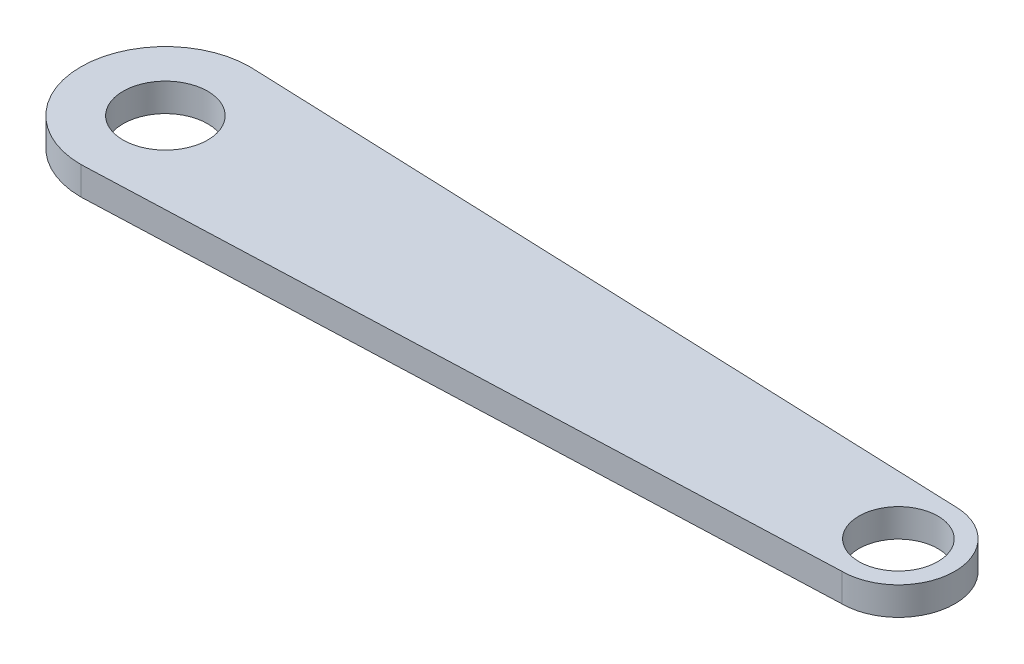
ISO-10303-21;
HEADER;
FILE_DESCRIPTION(('STEP AP214'),'2;1');
FILE_NAME('part.step','',(''),(''),'','','');
FILE_SCHEMA(('AUTOMOTIVE_DESIGN { 1 0 10303 214 1 1 1 1 }'));
ENDSEC;
DATA;
#1=APPLICATION_CONTEXT('core data for automotive mechanical design processes');
#2=APPLICATION_PROTOCOL_DEFINITION('international standard','automotive_design',2000,#1);
#3=PRODUCT_CONTEXT('',#1,'mechanical');
#4=PRODUCT('Part','Part','',(#3));
#5=PRODUCT_RELATED_PRODUCT_CATEGORY('part','',(#4));
#6=PRODUCT_DEFINITION_FORMATION('','',#4);
#7=PRODUCT_DEFINITION_CONTEXT('part definition',#1,'design');
#8=PRODUCT_DEFINITION('design','',#6,#7);
#9=PRODUCT_DEFINITION_SHAPE('','',#8);
#10=(LENGTH_UNIT() NAMED_UNIT(*) SI_UNIT(.MILLI.,.METRE.));
#11=(NAMED_UNIT(*) PLANE_ANGLE_UNIT() SI_UNIT($,.RADIAN.));
#12=(NAMED_UNIT(*) SI_UNIT($,.STERADIAN.) SOLID_ANGLE_UNIT());
#13=UNCERTAINTY_MEASURE_WITH_UNIT(LENGTH_MEASURE(1.E-05),#10,'distance_accuracy_value','');
#14=(GEOMETRIC_REPRESENTATION_CONTEXT(3) GLOBAL_UNCERTAINTY_ASSIGNED_CONTEXT((#13)) GLOBAL_UNIT_ASSIGNED_CONTEXT((#10,
#11,#12)) REPRESENTATION_CONTEXT('',''));
#15=CARTESIAN_POINT('',(0.,0.,0.));
#16=DIRECTION('',(0.,0.,1.));
#17=DIRECTION('',(1.,0.,0.));
#18=AXIS2_PLACEMENT_3D('',#15,#16,#17);
#19=CARTESIAN_POINT('',(-115.540454705686,5.,0.));
#20=DIRECTION('',(0.,-1.,0.));
#21=DIRECTION('',(0.,0.,-1.));
#22=AXIS2_PLACEMENT_3D('',#19,#20,#21);
#23=CYLINDRICAL_SURFACE('',#22,15.);
#24=CARTESIAN_POINT('',(-115.540454705686,0.,0.));
#25=DIRECTION('',(0.,1.,0.));
#26=DIRECTION('',(0.,0.,1.));
#27=AXIS2_PLACEMENT_3D('',#24,#25,#26);
#28=CIRCLE('',#27,15.);
#29=CARTESIAN_POINT('',(-115.540454705686,0.,-15.));
#30=VERTEX_POINT('',#29);
#31=CARTESIAN_POINT('',(-115.540454705686,0.,15.));
#32=VERTEX_POINT('',#31);
#33=EDGE_CURVE('E96',#30,#32,#28,.T.);
#34=ORIENTED_EDGE('',*,*,#33,.T.);
#35=DIRECTION('',(0.,-1.,0.));
#36=VECTOR('',#35,1.);
#37=CARTESIAN_POINT('',(-115.540454705686,5.,15.));
#38=LINE('',#37,#36);
#39=CARTESIAN_POINT('',(-115.540454705686,5.,15.));
#40=VERTEX_POINT('',#39);
#41=EDGE_CURVE('E11',#40,#32,#38,.T.);
#42=ORIENTED_EDGE('',*,*,#41,.F.);
#43=CARTESIAN_POINT('',(-115.540454705686,5.,0.));
#44=DIRECTION('',(0.,1.,0.));
#45=DIRECTION('',(0.,0.,1.));
#46=AXIS2_PLACEMENT_3D('',#43,#44,#45);
#47=CIRCLE('',#46,15.);
#48=CARTESIAN_POINT('',(-115.540454705686,5.,-15.));
#49=VERTEX_POINT('',#48);
#50=EDGE_CURVE('E84',#49,#40,#47,.T.);
#51=ORIENTED_EDGE('',*,*,#50,.F.);
#52=DIRECTION('',(0.,-1.,0.));
#53=VECTOR('',#52,1.);
#54=CARTESIAN_POINT('',(-115.540454705686,5.,-15.));
#55=LINE('',#54,#53);
#56=EDGE_CURVE('E92',#49,#30,#55,.T.);
#57=ORIENTED_EDGE('',*,*,#56,.T.);
#58=EDGE_LOOP('',(#34,#42,#51,#57));
#59=FACE_BOUND('',#58,.T.);
#60=ADVANCED_FACE('F33',(#59),#23,.T.);
#61=CARTESIAN_POINT('',(-115.540454705686,5.,15.));
#62=DIRECTION('',(-0.0384331221012044,0.,-0.999261174631314));
#63=DIRECTION('',(-0.999261174631314,0.,0.0384331221012044));
#64=AXIS2_PLACEMENT_3D('',#61,#62,#63);
#65=PLANE('',#64);
#66=DIRECTION('',(0.999261174631314,0.,-0.0384331221012044));
#67=VECTOR('',#66,1.);
#68=CARTESIAN_POINT('',(-115.540454705686,0.,15.));
#69=LINE('',#68,#67);
#70=CARTESIAN_POINT('',(14.459545294314,0.,10.));
#71=VERTEX_POINT('',#70);
#72=EDGE_CURVE('E88',#32,#71,#69,.T.);
#73=ORIENTED_EDGE('',*,*,#72,.T.);
#74=DIRECTION('',(0.,-1.,0.));
#75=VECTOR('',#74,1.);
#76=CARTESIAN_POINT('',(14.459545294314,5.,10.));
#77=LINE('',#76,#75);
#78=CARTESIAN_POINT('',(14.459545294314,5.,10.));
#79=VERTEX_POINT('',#78);
#80=EDGE_CURVE('E41',#79,#71,#77,.T.);
#81=ORIENTED_EDGE('',*,*,#80,.F.);
#82=DIRECTION('',(0.999261174631314,0.,-0.0384331221012044));
#83=VECTOR('',#82,1.);
#84=CARTESIAN_POINT('',(-115.540454705686,5.,15.));
#85=LINE('',#84,#83);
#86=EDGE_CURVE('E79',#40,#79,#85,.T.);
#87=ORIENTED_EDGE('',*,*,#86,.F.);
#88=ORIENTED_EDGE('',*,*,#41,.T.);
#89=EDGE_LOOP('',(#73,#81,#87,#88));
#90=FACE_BOUND('',#89,.T.);
#91=ADVANCED_FACE('F87',(#90),#65,.F.);
#92=CARTESIAN_POINT('',(14.459545294314,5.,0.));
#93=DIRECTION('',(0.,-1.,0.));
#94=DIRECTION('',(0.,0.,-1.));
#95=AXIS2_PLACEMENT_3D('',#92,#93,#94);
#96=CYLINDRICAL_SURFACE('',#95,10.);
#97=CARTESIAN_POINT('',(14.459545294314,0.,0.));
#98=DIRECTION('',(0.,1.,0.));
#99=DIRECTION('',(0.,0.,1.));
#100=AXIS2_PLACEMENT_3D('',#97,#98,#99);
#101=CIRCLE('',#100,10.);
#102=CARTESIAN_POINT('',(14.459545294314,0.,-10.));
#103=VERTEX_POINT('',#102);
#104=EDGE_CURVE('E66',#71,#103,#101,.T.);
#105=ORIENTED_EDGE('',*,*,#104,.T.);
#106=DIRECTION('',(0.,-1.,0.));
#107=VECTOR('',#106,1.);
#108=CARTESIAN_POINT('',(14.459545294314,5.,-10.));
#109=LINE('',#108,#107);
#110=CARTESIAN_POINT('',(14.459545294314,5.,-10.));
#111=VERTEX_POINT('',#110);
#112=EDGE_CURVE('E89',#111,#103,#109,.T.);
#113=ORIENTED_EDGE('',*,*,#112,.F.);
#114=CARTESIAN_POINT('',(14.459545294314,5.,0.));
#115=DIRECTION('',(0.,1.,0.));
#116=DIRECTION('',(0.,0.,1.));
#117=AXIS2_PLACEMENT_3D('',#114,#115,#116);
#118=CIRCLE('',#117,10.);
#119=EDGE_CURVE('E82',#79,#111,#118,.T.);
#120=ORIENTED_EDGE('',*,*,#119,.F.);
#121=ORIENTED_EDGE('',*,*,#80,.T.);
#122=EDGE_LOOP('',(#105,#113,#120,#121));
#123=FACE_BOUND('',#122,.T.);
#124=ADVANCED_FACE('F90',(#123),#96,.T.);
#125=CARTESIAN_POINT('',(-115.540454705686,5.,-15.));
#126=DIRECTION('',(-0.0384331221012044,0.,0.999261174631314));
#127=DIRECTION('',(0.999261174631314,0.,0.0384331221012044));
#128=AXIS2_PLACEMENT_3D('',#125,#126,#127);
#129=PLANE('',#128);
#130=DIRECTION('',(-0.999261174631314,0.,-0.0384331221012044));
#131=VECTOR('',#130,1.);
#132=CARTESIAN_POINT('',(-115.540454705686,0.,-15.));
#133=LINE('',#132,#131);
#134=EDGE_CURVE('E72',#103,#30,#133,.T.);
#135=ORIENTED_EDGE('',*,*,#134,.T.);
#136=ORIENTED_EDGE('',*,*,#56,.F.);
#137=DIRECTION('',(-0.999261174631314,0.,-0.0384331221012044));
#138=VECTOR('',#137,1.);
#139=CARTESIAN_POINT('',(-115.540454705686,5.,-15.));
#140=LINE('',#139,#138);
#141=EDGE_CURVE('E49',#111,#49,#140,.T.);
#142=ORIENTED_EDGE('',*,*,#141,.F.);
#143=ORIENTED_EDGE('',*,*,#112,.T.);
#144=EDGE_LOOP('',(#135,#136,#142,#143));
#145=FACE_BOUND('',#144,.T.);
#146=ADVANCED_FACE('F104',(#145),#129,.F.);
#147=CARTESIAN_POINT('',(-115.540454705686,5.,0.));
#148=DIRECTION('',(0.,1.,0.));
#149=DIRECTION('',(0.,0.,1.));
#150=AXIS2_PLACEMENT_3D('',#147,#148,#149);
#151=PLANE('',#150);
#152=CARTESIAN_POINT('',(14.459545294314,5.,0.));
#153=DIRECTION('',(0.,1.,0.));
#154=DIRECTION('',(0.,0.,1.));
#155=AXIS2_PLACEMENT_3D('',#152,#153,#154);
#156=CIRCLE('',#155,7.);
#157=CARTESIAN_POINT('',(14.459545294314,5.,7.));
#158=VERTEX_POINT('',#157);
#159=EDGE_CURVE('E99',#158,#158,#156,.T.);
#160=ORIENTED_EDGE('',*,*,#159,.F.);
#161=EDGE_LOOP('',(#160));
#162=FACE_BOUND('',#161,.T.);
#163=CARTESIAN_POINT('',(-115.540454705686,5.,0.));
#164=DIRECTION('',(0.,1.,0.));
#165=DIRECTION('',(0.,0.,1.));
#166=AXIS2_PLACEMENT_3D('',#163,#164,#165);
#167=CIRCLE('',#166,7.50000000000001);
#168=CARTESIAN_POINT('',(-115.540454705686,5.,7.50000000000001));
#169=VERTEX_POINT('',#168);
#170=EDGE_CURVE('E112',#169,#169,#167,.T.);
#171=ORIENTED_EDGE('',*,*,#170,.F.);
#172=EDGE_LOOP('',(#171));
#173=FACE_BOUND('',#172,.T.);
#174=ORIENTED_EDGE('',*,*,#50,.T.);
#175=ORIENTED_EDGE('',*,*,#86,.T.);
#176=ORIENTED_EDGE('',*,*,#119,.T.);
#177=ORIENTED_EDGE('',*,*,#141,.T.);
#178=EDGE_LOOP('',(#174,#175,#176,#177));
#179=FACE_BOUND('',#178,.T.);
#180=ADVANCED_FACE('F80',(#162,#173,#179),#151,.T.);
#181=CARTESIAN_POINT('',(-115.540454705686,0.,0.));
#182=DIRECTION('',(0.,1.,0.));
#183=DIRECTION('',(0.,0.,1.));
#184=AXIS2_PLACEMENT_3D('',#181,#182,#183);
#185=PLANE('',#184);
#186=CARTESIAN_POINT('',(14.459545294314,0.,0.));
#187=DIRECTION('',(0.,-1.,0.));
#188=DIRECTION('',(0.,0.,-1.));
#189=AXIS2_PLACEMENT_3D('',#186,#187,#188);
#190=CIRCLE('',#189,7.);
#191=CARTESIAN_POINT('',(14.459545294314,0.,-7.));
#192=VERTEX_POINT('',#191);
#193=EDGE_CURVE('E115',#192,#192,#190,.T.);
#194=ORIENTED_EDGE('',*,*,#193,.F.);
#195=EDGE_LOOP('',(#194));
#196=FACE_BOUND('',#195,.T.);
#197=CARTESIAN_POINT('',(-115.540454705686,0.,0.));
#198=DIRECTION('',(0.,-1.,0.));
#199=DIRECTION('',(0.,0.,-1.));
#200=AXIS2_PLACEMENT_3D('',#197,#198,#199);
#201=CIRCLE('',#200,7.50000000000001);
#202=CARTESIAN_POINT('',(-115.540454705686,0.,-7.50000000000001));
#203=VERTEX_POINT('',#202);
#204=EDGE_CURVE('E116',#203,#203,#201,.T.);
#205=ORIENTED_EDGE('',*,*,#204,.F.);
#206=EDGE_LOOP('',(#205));
#207=FACE_BOUND('',#206,.T.);
#208=ORIENTED_EDGE('',*,*,#33,.F.);
#209=ORIENTED_EDGE('',*,*,#134,.F.);
#210=ORIENTED_EDGE('',*,*,#104,.F.);
#211=ORIENTED_EDGE('',*,*,#72,.F.);
#212=EDGE_LOOP('',(#208,#209,#210,#211));
#213=FACE_BOUND('',#212,.T.);
#214=ADVANCED_FACE('F107',(#196,#207,#213),#185,.F.);
#215=CARTESIAN_POINT('',(-115.540454705686,10.,0.));
#216=DIRECTION('',(0.,-1.,0.));
#217=DIRECTION('',(0.,0.,-1.));
#218=AXIS2_PLACEMENT_3D('',#215,#216,#217);
#219=CYLINDRICAL_SURFACE('',#218,7.50000000000001);
#220=ORIENTED_EDGE('',*,*,#170,.T.);
#221=EDGE_LOOP('',(#220));
#222=FACE_BOUND('',#221,.T.);
#223=ORIENTED_EDGE('',*,*,#204,.T.);
#224=EDGE_LOOP('',(#223));
#225=FACE_BOUND('',#224,.T.);
#226=ADVANCED_FACE('F126',(#222,#225),#219,.F.);
#227=CARTESIAN_POINT('',(14.459545294314,10.,0.));
#228=DIRECTION('',(0.,-1.,0.));
#229=DIRECTION('',(0.,0.,-1.));
#230=AXIS2_PLACEMENT_3D('',#227,#228,#229);
#231=CYLINDRICAL_SURFACE('',#230,7.);
#232=ORIENTED_EDGE('',*,*,#159,.T.);
#233=EDGE_LOOP('',(#232));
#234=FACE_BOUND('',#233,.T.);
#235=ORIENTED_EDGE('',*,*,#193,.T.);
#236=EDGE_LOOP('',(#235));
#237=FACE_BOUND('',#236,.T.);
#238=ADVANCED_FACE('F122',(#234,#237),#231,.F.);
#239=CLOSED_SHELL('',(#60,#91,#124,#146,#180,#214,#226,#238));
#240=MANIFOLD_SOLID_BREP('B2',#239);
#241=ADVANCED_BREP_SHAPE_REPRESENTATION('',(#18,#240),#14);
#242=SHAPE_DEFINITION_REPRESENTATION(#9,#241);
ENDSEC;
END-ISO-10303-21;
